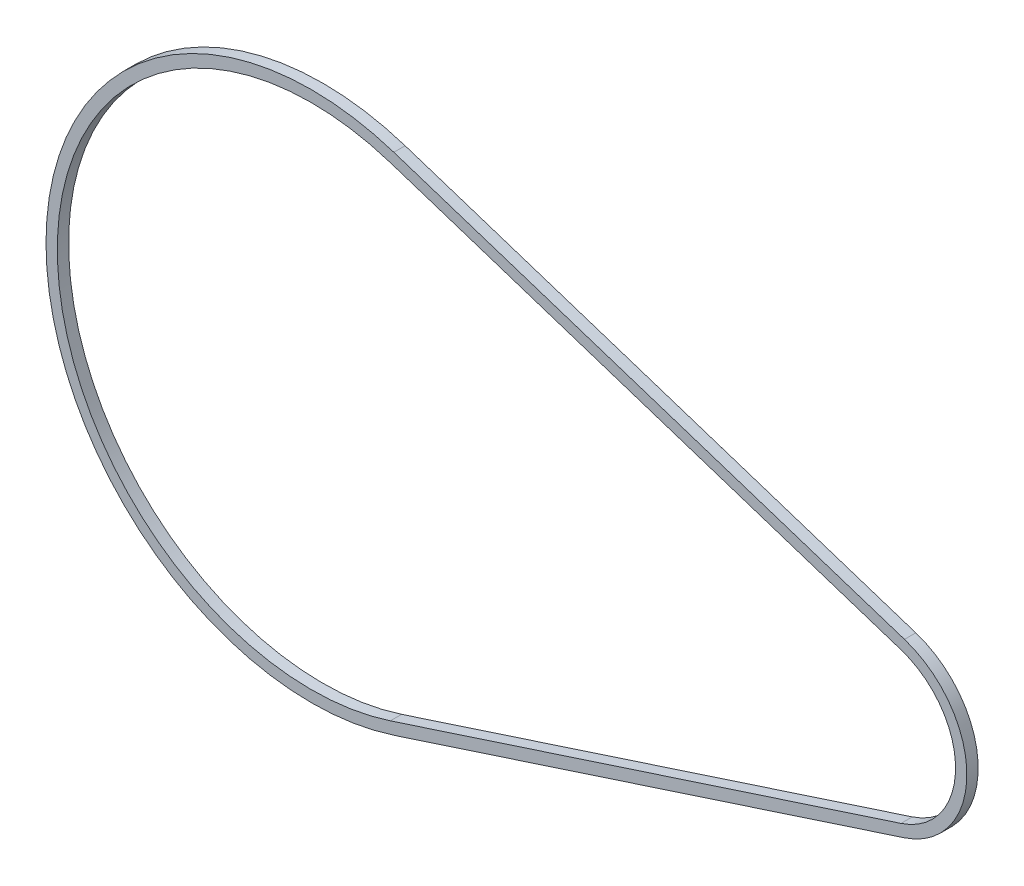
ISO-10303-21;
HEADER;
FILE_DESCRIPTION(('STEP AP214'),'2;1');
FILE_NAME('part.step','',(''),(''),'','','');
FILE_SCHEMA(('AUTOMOTIVE_DESIGN { 1 0 10303 214 1 1 1 1 }'));
ENDSEC;
DATA;
#1=APPLICATION_CONTEXT('core data for automotive mechanical design processes');
#2=APPLICATION_PROTOCOL_DEFINITION('international standard','automotive_design',2000,#1);
#3=PRODUCT_CONTEXT('',#1,'mechanical');
#4=PRODUCT('Part','Part','',(#3));
#5=PRODUCT_RELATED_PRODUCT_CATEGORY('part','',(#4));
#6=PRODUCT_DEFINITION_FORMATION('','',#4);
#7=PRODUCT_DEFINITION_CONTEXT('part definition',#1,'design');
#8=PRODUCT_DEFINITION('design','',#6,#7);
#9=PRODUCT_DEFINITION_SHAPE('','',#8);
#10=(LENGTH_UNIT() NAMED_UNIT(*) SI_UNIT(.MILLI.,.METRE.));
#11=(NAMED_UNIT(*) PLANE_ANGLE_UNIT() SI_UNIT($,.RADIAN.));
#12=(NAMED_UNIT(*) SI_UNIT($,.STERADIAN.) SOLID_ANGLE_UNIT());
#13=UNCERTAINTY_MEASURE_WITH_UNIT(LENGTH_MEASURE(1.E-05),#10,'distance_accuracy_value','');
#14=(GEOMETRIC_REPRESENTATION_CONTEXT(3) GLOBAL_UNCERTAINTY_ASSIGNED_CONTEXT((#13)) GLOBAL_UNIT_ASSIGNED_CONTEXT((#10,
#11,#12)) REPRESENTATION_CONTEXT('',''));
#15=CARTESIAN_POINT('',(0.,0.,0.));
#16=DIRECTION('',(0.,0.,1.));
#17=DIRECTION('',(1.,0.,0.));
#18=AXIS2_PLACEMENT_3D('',#15,#16,#17);
#19=CARTESIAN_POINT('',(0.,0.,10.));
#20=DIRECTION('',(0.,0.,1.));
#21=DIRECTION('',(1.,0.,0.));
#22=AXIS2_PLACEMENT_3D('',#19,#20,#21);
#23=PLANE('',#22);
#24=CARTESIAN_POINT('',(0.,0.,10.));
#25=DIRECTION('',(0.,0.,1.));
#26=DIRECTION('',(1.,0.,0.));
#27=AXIS2_PLACEMENT_3D('',#24,#25,#26);
#28=CIRCLE('',#27,235.);
#29=CARTESIAN_POINT('',(72.85,223.423090794125,10.));
#30=VERTEX_POINT('',#29);
#31=CARTESIAN_POINT('',(72.85,-223.423090794125,10.));
#32=VERTEX_POINT('',#31);
#33=EDGE_CURVE('E156',#30,#32,#28,.T.);
#34=ORIENTED_EDGE('',*,*,#33,.T.);
#35=DIRECTION('',(0.950736556570746,0.31,0.));
#36=VECTOR('',#35,1.);
#37=CARTESIAN_POINT('',(72.85,-223.423090794125,10.));
#38=LINE('',#37,#36);
#39=CARTESIAN_POINT('',(524.8,-76.0589245256597,10.));
#40=VERTEX_POINT('',#39);
#41=EDGE_CURVE('E160',#32,#40,#38,.T.);
#42=ORIENTED_EDGE('',*,*,#41,.T.);
#43=CARTESIAN_POINT('',(500.,0.,10.));
#44=DIRECTION('',(0.,0.,1.));
#45=DIRECTION('',(1.,0.,0.));
#46=AXIS2_PLACEMENT_3D('',#43,#44,#45);
#47=CIRCLE('',#46,80.);
#48=CARTESIAN_POINT('',(524.8,76.0589245256597,10.));
#49=VERTEX_POINT('',#48);
#50=EDGE_CURVE('E164',#40,#49,#47,.T.);
#51=ORIENTED_EDGE('',*,*,#50,.T.);
#52=DIRECTION('',(-0.950736556570746,0.31,0.));
#53=VECTOR('',#52,1.);
#54=CARTESIAN_POINT('',(72.85,223.423090794125,10.));
#55=LINE('',#54,#53);
#56=EDGE_CURVE('E167',#49,#30,#55,.T.);
#57=ORIENTED_EDGE('',*,*,#56,.T.);
#58=EDGE_LOOP('',(#34,#42,#51,#57));
#59=FACE_BOUND('',#58,.T.);
#60=DIRECTION('',(0.950736556570746,0.31,0.));
#61=VECTOR('',#60,1.);
#62=CARTESIAN_POINT('',(69.75,-213.915725228418,10.));
#63=LINE('',#62,#61);
#64=CARTESIAN_POINT('',(69.75,-213.915725228418,10.));
#65=VERTEX_POINT('',#64);
#66=CARTESIAN_POINT('',(521.7,-66.5515589599522,10.));
#67=VERTEX_POINT('',#66);
#68=EDGE_CURVE('E117',#65,#67,#63,.T.);
#69=ORIENTED_EDGE('',*,*,#68,.F.);
#70=CARTESIAN_POINT('',(0.,0.,10.));
#71=DIRECTION('',(0.,0.,1.));
#72=DIRECTION('',(1.,0.,0.));
#73=AXIS2_PLACEMENT_3D('',#70,#71,#72);
#74=CIRCLE('',#73,225.);
#75=CARTESIAN_POINT('',(69.75,213.915725228418,10.));
#76=VERTEX_POINT('',#75);
#77=EDGE_CURVE('E108',#76,#65,#74,.T.);
#78=ORIENTED_EDGE('',*,*,#77,.F.);
#79=DIRECTION('',(-0.950736556570746,0.31,0.));
#80=VECTOR('',#79,1.);
#81=CARTESIAN_POINT('',(69.75,213.915725228418,10.));
#82=LINE('',#81,#80);
#83=CARTESIAN_POINT('',(521.7,66.5515589599522,10.));
#84=VERTEX_POINT('',#83);
#85=EDGE_CURVE('E134',#84,#76,#82,.T.);
#86=ORIENTED_EDGE('',*,*,#85,.F.);
#87=CARTESIAN_POINT('',(500.,0.,10.));
#88=DIRECTION('',(0.,0.,1.));
#89=DIRECTION('',(1.,0.,0.));
#90=AXIS2_PLACEMENT_3D('',#87,#88,#89);
#91=CIRCLE('',#90,70.);
#92=EDGE_CURVE('E130',#67,#84,#91,.T.);
#93=ORIENTED_EDGE('',*,*,#92,.F.);
#94=EDGE_LOOP('',(#69,#78,#86,#93));
#95=FACE_BOUND('',#94,.T.);
#96=ADVANCED_FACE('F42',(#59,#95),#23,.T.);
#97=CARTESIAN_POINT('',(0.,0.,0.));
#98=DIRECTION('',(0.,0.,1.));
#99=DIRECTION('',(1.,0.,0.));
#100=AXIS2_PLACEMENT_3D('',#97,#98,#99);
#101=PLANE('',#100);
#102=CARTESIAN_POINT('',(0.,0.,0.));
#103=DIRECTION('',(0.,0.,1.));
#104=DIRECTION('',(1.,0.,0.));
#105=AXIS2_PLACEMENT_3D('',#102,#103,#104);
#106=CIRCLE('',#105,235.);
#107=CARTESIAN_POINT('',(72.85,223.423090794125,0.));
#108=VERTEX_POINT('',#107);
#109=CARTESIAN_POINT('',(72.85,-223.423090794125,0.));
#110=VERTEX_POINT('',#109);
#111=EDGE_CURVE('E126',#108,#110,#106,.T.);
#112=ORIENTED_EDGE('',*,*,#111,.F.);
#113=DIRECTION('',(-0.950736556570746,0.31,0.));
#114=VECTOR('',#113,1.);
#115=CARTESIAN_POINT('',(72.85,223.423090794125,0.));
#116=LINE('',#115,#114);
#117=CARTESIAN_POINT('',(524.8,76.0589245256597,0.));
#118=VERTEX_POINT('',#117);
#119=EDGE_CURVE('E161',#118,#108,#116,.T.);
#120=ORIENTED_EDGE('',*,*,#119,.F.);
#121=CARTESIAN_POINT('',(500.,0.,0.));
#122=DIRECTION('',(0.,0.,1.));
#123=DIRECTION('',(1.,0.,0.));
#124=AXIS2_PLACEMENT_3D('',#121,#122,#123);
#125=CIRCLE('',#124,80.);
#126=CARTESIAN_POINT('',(524.8,-76.0589245256597,0.));
#127=VERTEX_POINT('',#126);
#128=EDGE_CURVE('E177',#127,#118,#125,.T.);
#129=ORIENTED_EDGE('',*,*,#128,.F.);
#130=DIRECTION('',(0.950736556570746,0.31,0.));
#131=VECTOR('',#130,1.);
#132=CARTESIAN_POINT('',(72.85,-223.423090794125,0.));
#133=LINE('',#132,#131);
#134=EDGE_CURVE('E174',#110,#127,#133,.T.);
#135=ORIENTED_EDGE('',*,*,#134,.F.);
#136=EDGE_LOOP('',(#112,#120,#129,#135));
#137=FACE_BOUND('',#136,.T.);
#138=CARTESIAN_POINT('',(0.,0.,0.));
#139=DIRECTION('',(0.,0.,1.));
#140=DIRECTION('',(1.,0.,0.));
#141=AXIS2_PLACEMENT_3D('',#138,#139,#140);
#142=CIRCLE('',#141,225.);
#143=CARTESIAN_POINT('',(69.75,213.915725228418,0.));
#144=VERTEX_POINT('',#143);
#145=CARTESIAN_POINT('',(69.75,-213.915725228418,0.));
#146=VERTEX_POINT('',#145);
#147=EDGE_CURVE('E66',#144,#146,#142,.T.);
#148=ORIENTED_EDGE('',*,*,#147,.T.);
#149=DIRECTION('',(0.950736556570746,0.31,0.));
#150=VECTOR('',#149,1.);
#151=CARTESIAN_POINT('',(69.75,-213.915725228418,0.));
#152=LINE('',#151,#150);
#153=CARTESIAN_POINT('',(521.7,-66.5515589599522,0.));
#154=VERTEX_POINT('',#153);
#155=EDGE_CURVE('E124',#146,#154,#152,.T.);
#156=ORIENTED_EDGE('',*,*,#155,.T.);
#157=CARTESIAN_POINT('',(500.,0.,0.));
#158=DIRECTION('',(0.,0.,1.));
#159=DIRECTION('',(1.,0.,0.));
#160=AXIS2_PLACEMENT_3D('',#157,#158,#159);
#161=CIRCLE('',#160,70.);
#162=CARTESIAN_POINT('',(521.7,66.5515589599522,0.));
#163=VERTEX_POINT('',#162);
#164=EDGE_CURVE('E143',#154,#163,#161,.T.);
#165=ORIENTED_EDGE('',*,*,#164,.T.);
#166=DIRECTION('',(-0.950736556570746,0.31,0.));
#167=VECTOR('',#166,1.);
#168=CARTESIAN_POINT('',(69.75,213.915725228418,0.));
#169=LINE('',#168,#167);
#170=EDGE_CURVE('E118',#163,#144,#169,.T.);
#171=ORIENTED_EDGE('',*,*,#170,.T.);
#172=EDGE_LOOP('',(#148,#156,#165,#171));
#173=FACE_BOUND('',#172,.T.);
#174=ADVANCED_FACE('F200',(#137,#173),#101,.F.);
#175=CARTESIAN_POINT('',(0.,0.,10.));
#176=DIRECTION('',(0.,0.,-1.));
#177=DIRECTION('',(-1.,0.,0.));
#178=AXIS2_PLACEMENT_3D('',#175,#176,#177);
#179=CYLINDRICAL_SURFACE('',#178,235.);
#180=ORIENTED_EDGE('',*,*,#111,.T.);
#181=DIRECTION('',(0.,0.,-1.));
#182=VECTOR('',#181,1.);
#183=CARTESIAN_POINT('',(72.85,-223.423090794125,10.));
#184=LINE('',#183,#182);
#185=EDGE_CURVE('E11',#32,#110,#184,.T.);
#186=ORIENTED_EDGE('',*,*,#185,.F.);
#187=ORIENTED_EDGE('',*,*,#33,.F.);
#188=DIRECTION('',(0.,0.,-1.));
#189=VECTOR('',#188,1.);
#190=CARTESIAN_POINT('',(72.85,223.423090794125,10.));
#191=LINE('',#190,#189);
#192=EDGE_CURVE('E170',#30,#108,#191,.T.);
#193=ORIENTED_EDGE('',*,*,#192,.T.);
#194=EDGE_LOOP('',(#180,#186,#187,#193));
#195=FACE_BOUND('',#194,.T.);
#196=ADVANCED_FACE('F44',(#195),#179,.T.);
#197=CARTESIAN_POINT('',(72.85,-223.423090794125,10.));
#198=DIRECTION('',(-0.31,0.950736556570746,0.));
#199=DIRECTION('',(-0.950736556570746,-0.31,0.));
#200=AXIS2_PLACEMENT_3D('',#197,#198,#199);
#201=PLANE('',#200);
#202=ORIENTED_EDGE('',*,*,#134,.T.);
#203=DIRECTION('',(0.,0.,-1.));
#204=VECTOR('',#203,1.);
#205=CARTESIAN_POINT('',(524.8,-76.0589245256597,10.));
#206=LINE('',#205,#204);
#207=EDGE_CURVE('E51',#40,#127,#206,.T.);
#208=ORIENTED_EDGE('',*,*,#207,.F.);
#209=ORIENTED_EDGE('',*,*,#41,.F.);
#210=ORIENTED_EDGE('',*,*,#185,.T.);
#211=EDGE_LOOP('',(#202,#208,#209,#210));
#212=FACE_BOUND('',#211,.T.);
#213=ADVANCED_FACE('F210',(#212),#201,.F.);
#214=CARTESIAN_POINT('',(500.,0.,10.));
#215=DIRECTION('',(0.,0.,-1.));
#216=DIRECTION('',(-1.,0.,0.));
#217=AXIS2_PLACEMENT_3D('',#214,#215,#216);
#218=CYLINDRICAL_SURFACE('',#217,80.);
#219=ORIENTED_EDGE('',*,*,#128,.T.);
#220=DIRECTION('',(0.,0.,-1.));
#221=VECTOR('',#220,1.);
#222=CARTESIAN_POINT('',(524.8,76.0589245256597,10.));
#223=LINE('',#222,#221);
#224=EDGE_CURVE('E185',#49,#118,#223,.T.);
#225=ORIENTED_EDGE('',*,*,#224,.F.);
#226=ORIENTED_EDGE('',*,*,#50,.F.);
#227=ORIENTED_EDGE('',*,*,#207,.T.);
#228=EDGE_LOOP('',(#219,#225,#226,#227));
#229=FACE_BOUND('',#228,.T.);
#230=ADVANCED_FACE('F194',(#229),#218,.T.);
#231=CARTESIAN_POINT('',(72.85,223.423090794125,10.));
#232=DIRECTION('',(-0.31,-0.950736556570746,0.));
#233=DIRECTION('',(0.950736556570746,-0.31,0.));
#234=AXIS2_PLACEMENT_3D('',#231,#232,#233);
#235=PLANE('',#234);
#236=ORIENTED_EDGE('',*,*,#119,.T.);
#237=ORIENTED_EDGE('',*,*,#192,.F.);
#238=ORIENTED_EDGE('',*,*,#56,.F.);
#239=ORIENTED_EDGE('',*,*,#224,.T.);
#240=EDGE_LOOP('',(#236,#237,#238,#239));
#241=FACE_BOUND('',#240,.T.);
#242=ADVANCED_FACE('F204',(#241),#235,.F.);
#243=CARTESIAN_POINT('',(0.,0.,10.));
#244=DIRECTION('',(0.,0.,-1.));
#245=DIRECTION('',(-1.,0.,0.));
#246=AXIS2_PLACEMENT_3D('',#243,#244,#245);
#247=CYLINDRICAL_SURFACE('',#246,225.);
#248=ORIENTED_EDGE('',*,*,#147,.F.);
#249=DIRECTION('',(0.,0.,-1.));
#250=VECTOR('',#249,1.);
#251=CARTESIAN_POINT('',(69.75,213.915725228418,10.));
#252=LINE('',#251,#250);
#253=EDGE_CURVE('E112',#76,#144,#252,.T.);
#254=ORIENTED_EDGE('',*,*,#253,.F.);
#255=ORIENTED_EDGE('',*,*,#77,.T.);
#256=DIRECTION('',(0.,0.,-1.));
#257=VECTOR('',#256,1.);
#258=CARTESIAN_POINT('',(69.75,-213.915725228418,10.));
#259=LINE('',#258,#257);
#260=EDGE_CURVE('E111',#65,#146,#259,.T.);
#261=ORIENTED_EDGE('',*,*,#260,.T.);
#262=EDGE_LOOP('',(#248,#254,#255,#261));
#263=FACE_BOUND('',#262,.T.);
#264=ADVANCED_FACE('F110',(#263),#247,.F.);
#265=CARTESIAN_POINT('',(69.75,-213.915725228418,10.));
#266=DIRECTION('',(-0.31,0.950736556570746,0.));
#267=DIRECTION('',(-0.950736556570746,-0.31,0.));
#268=AXIS2_PLACEMENT_3D('',#265,#266,#267);
#269=PLANE('',#268);
#270=ORIENTED_EDGE('',*,*,#155,.F.);
#271=ORIENTED_EDGE('',*,*,#260,.F.);
#272=ORIENTED_EDGE('',*,*,#68,.T.);
#273=DIRECTION('',(0.,0.,-1.));
#274=VECTOR('',#273,1.);
#275=CARTESIAN_POINT('',(521.7,-66.5515589599522,10.));
#276=LINE('',#275,#274);
#277=EDGE_CURVE('E127',#67,#154,#276,.T.);
#278=ORIENTED_EDGE('',*,*,#277,.T.);
#279=EDGE_LOOP('',(#270,#271,#272,#278));
#280=FACE_BOUND('',#279,.T.);
#281=ADVANCED_FACE('F121',(#280),#269,.T.);
#282=CARTESIAN_POINT('',(500.,0.,10.));
#283=DIRECTION('',(0.,0.,-1.));
#284=DIRECTION('',(-1.,0.,0.));
#285=AXIS2_PLACEMENT_3D('',#282,#283,#284);
#286=CYLINDRICAL_SURFACE('',#285,70.);
#287=ORIENTED_EDGE('',*,*,#164,.F.);
#288=ORIENTED_EDGE('',*,*,#277,.F.);
#289=ORIENTED_EDGE('',*,*,#92,.T.);
#290=DIRECTION('',(0.,0.,-1.));
#291=VECTOR('',#290,1.);
#292=CARTESIAN_POINT('',(521.7,66.5515589599522,10.));
#293=LINE('',#292,#291);
#294=EDGE_CURVE('E58',#84,#163,#293,.T.);
#295=ORIENTED_EDGE('',*,*,#294,.T.);
#296=EDGE_LOOP('',(#287,#288,#289,#295));
#297=FACE_BOUND('',#296,.T.);
#298=ADVANCED_FACE('F233',(#297),#286,.F.);
#299=CARTESIAN_POINT('',(69.75,213.915725228418,10.));
#300=DIRECTION('',(-0.31,-0.950736556570746,0.));
#301=DIRECTION('',(0.950736556570746,-0.31,0.));
#302=AXIS2_PLACEMENT_3D('',#299,#300,#301);
#303=PLANE('',#302);
#304=ORIENTED_EDGE('',*,*,#170,.F.);
#305=ORIENTED_EDGE('',*,*,#294,.F.);
#306=ORIENTED_EDGE('',*,*,#85,.T.);
#307=ORIENTED_EDGE('',*,*,#253,.T.);
#308=EDGE_LOOP('',(#304,#305,#306,#307));
#309=FACE_BOUND('',#308,.T.);
#310=ADVANCED_FACE('F237',(#309),#303,.T.);
#311=CLOSED_SHELL('',(#96,#174,#196,#213,#230,#242,#264,#281,#298,#310));
#312=MANIFOLD_SOLID_BREP('B2',#311);
#313=ADVANCED_BREP_SHAPE_REPRESENTATION('',(#18,#312),#14);
#314=SHAPE_DEFINITION_REPRESENTATION(#9,#313);
ENDSEC;
END-ISO-10303-21;
